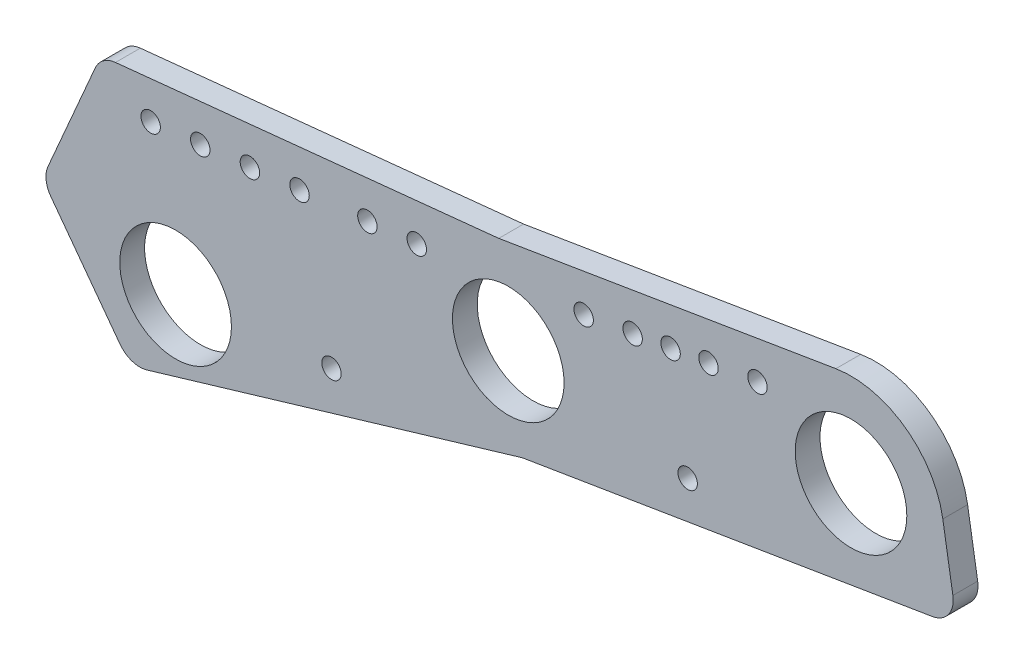
ISO-10303-21;
HEADER;
FILE_DESCRIPTION(('STEP AP214'),'2;1');
FILE_NAME('part.step','',(''),(''),'','','');
FILE_SCHEMA(('AUTOMOTIVE_DESIGN { 1 0 10303 214 1 1 1 1 }'));
ENDSEC;
DATA;
#1=APPLICATION_CONTEXT('core data for automotive mechanical design processes');
#2=APPLICATION_PROTOCOL_DEFINITION('international standard','automotive_design',2000,#1);
#3=PRODUCT_CONTEXT('',#1,'mechanical');
#4=PRODUCT('Part','Part','',(#3));
#5=PRODUCT_RELATED_PRODUCT_CATEGORY('part','',(#4));
#6=PRODUCT_DEFINITION_FORMATION('','',#4);
#7=PRODUCT_DEFINITION_CONTEXT('part definition',#1,'design');
#8=PRODUCT_DEFINITION('design','',#6,#7);
#9=PRODUCT_DEFINITION_SHAPE('','',#8);
#10=(LENGTH_UNIT() NAMED_UNIT(*) SI_UNIT(.MILLI.,.METRE.));
#11=(NAMED_UNIT(*) PLANE_ANGLE_UNIT() SI_UNIT($,.RADIAN.));
#12=(NAMED_UNIT(*) SI_UNIT($,.STERADIAN.) SOLID_ANGLE_UNIT());
#13=UNCERTAINTY_MEASURE_WITH_UNIT(LENGTH_MEASURE(1.E-05),#10,'distance_accuracy_value','');
#14=(GEOMETRIC_REPRESENTATION_CONTEXT(3) GLOBAL_UNCERTAINTY_ASSIGNED_CONTEXT((#13)) GLOBAL_UNIT_ASSIGNED_CONTEXT((#10,
#11,#12)) REPRESENTATION_CONTEXT('',''));
#15=CARTESIAN_POINT('',(0.,0.,0.));
#16=DIRECTION('',(0.,0.,1.));
#17=DIRECTION('',(1.,0.,0.));
#18=AXIS2_PLACEMENT_3D('',#15,#16,#17);
#19=CARTESIAN_POINT('',(731.086146989686,120.40181435366,6.35));
#20=DIRECTION('',(0.98670854359306,0.162500000001419,0.));
#21=DIRECTION('',(-0.162500000001419,0.986708543593061,0.));
#22=AXIS2_PLACEMENT_3D('',#19,#20,#21);
#23=PLANE('',#22);
#24=DIRECTION('',(0.162500000001419,-0.986708543593061,0.));
#25=VECTOR('',#24,1.);
#26=CARTESIAN_POINT('',(731.086146989686,120.40181435366,6.35));
#27=LINE('',#26,#25);
#28=CARTESIAN_POINT('',(693.805030313548,346.774714899592,6.35));
#29=VERTEX_POINT('',#28);
#30=CARTESIAN_POINT('',(696.384717564513,331.110718282341,6.35));
#31=VERTEX_POINT('',#30);
#32=EDGE_CURVE('E138',#29,#31,#27,.T.);
#33=ORIENTED_EDGE('',*,*,#32,.T.);
#34=DIRECTION('',(0.,0.,-1.));
#35=VECTOR('',#34,1.);
#36=CARTESIAN_POINT('',(696.384717564513,331.110718282341,0.));
#37=LINE('',#36,#35);
#38=CARTESIAN_POINT('',(696.384717564513,331.110718282341,0.));
#39=VERTEX_POINT('',#38);
#40=EDGE_CURVE('E281',#31,#39,#37,.T.);
#41=ORIENTED_EDGE('',*,*,#40,.T.);
#42=DIRECTION('',(0.162500000001419,-0.986708543593061,0.));
#43=VECTOR('',#42,1.);
#44=CARTESIAN_POINT('',(731.086146989686,120.40181435366,0.));
#45=LINE('',#44,#43);
#46=CARTESIAN_POINT('',(693.805030313548,346.774714899592,0.));
#47=VERTEX_POINT('',#46);
#48=EDGE_CURVE('E141',#47,#39,#45,.T.);
#49=ORIENTED_EDGE('',*,*,#48,.F.);
#50=DIRECTION('',(0.,0.,-1.));
#51=VECTOR('',#50,1.);
#52=CARTESIAN_POINT('',(693.805030313548,346.774714899592,6.35));
#53=LINE('',#52,#51);
#54=EDGE_CURVE('E134',#29,#47,#53,.T.);
#55=ORIENTED_EDGE('',*,*,#54,.F.);
#56=EDGE_LOOP('',(#33,#41,#49,#55));
#57=FACE_BOUND('',#56,.T.);
#58=ADVANCED_FACE('F39',(#57),#23,.T.);
#59=CARTESIAN_POINT('',(670.309034631527,342.905183898615,6.35));
#60=DIRECTION('',(0.,0.,-1.));
#61=DIRECTION('',(-1.,0.,0.));
#62=AXIS2_PLACEMENT_3D('',#59,#60,#61);
#63=CYLINDRICAL_SURFACE('',#62,23.8124984673398);
#64=CARTESIAN_POINT('',(670.309034631527,342.905183898615,0.));
#65=DIRECTION('',(0.,0.,1.));
#66=DIRECTION('',(1.,0.,0.));
#67=AXIS2_PLACEMENT_3D('',#64,#65,#66);
#68=CIRCLE('',#67,23.8124984673398);
#69=CARTESIAN_POINT('',(666.439503131669,366.401182605088,0.));
#70=VERTEX_POINT('',#69);
#71=EDGE_CURVE('E230',#47,#70,#68,.T.);
#72=ORIENTED_EDGE('',*,*,#71,.T.);
#73=DIRECTION('',(0.,0.,-1.));
#74=VECTOR('',#73,1.);
#75=CARTESIAN_POINT('',(666.439503131669,366.401182605088,6.35));
#76=LINE('',#75,#74);
#77=CARTESIAN_POINT('',(666.439503131669,366.401182605088,6.35));
#78=VERTEX_POINT('',#77);
#79=EDGE_CURVE('E146',#78,#70,#76,.T.);
#80=ORIENTED_EDGE('',*,*,#79,.F.);
#81=CARTESIAN_POINT('',(670.309034631527,342.905183898615,6.35));
#82=DIRECTION('',(0.,0.,1.));
#83=DIRECTION('',(1.,0.,0.));
#84=AXIS2_PLACEMENT_3D('',#81,#82,#83);
#85=CIRCLE('',#84,23.8124984673398);
#86=EDGE_CURVE('E149',#29,#78,#85,.T.);
#87=ORIENTED_EDGE('',*,*,#86,.F.);
#88=ORIENTED_EDGE('',*,*,#54,.T.);
#89=EDGE_LOOP('',(#72,#80,#87,#88));
#90=FACE_BOUND('',#89,.T.);
#91=ADVANCED_FACE('F150',(#90),#63,.T.);
#92=CARTESIAN_POINT('',(-41.2181103923822,249.488953926443,6.35));
#93=DIRECTION('',(-0.163000634952375,0.986625964084223,0.));
#94=DIRECTION('',(-0.986625964084223,-0.163000634952375,0.));
#95=AXIS2_PLACEMENT_3D('',#92,#93,#94);
#96=PLANE('',#95);
#97=DIRECTION('',(0.986625964084223,0.163000634952375,0.));
#98=VECTOR('',#97,1.);
#99=CARTESIAN_POINT('',(-41.2181103923822,249.488953926443,0.));
#100=LINE('',#99,#98);
#101=CARTESIAN_POINT('',(580.162002092372,352.147262717055,0.));
#102=VERTEX_POINT('',#101);
#103=EDGE_CURVE('E232',#102,#70,#100,.T.);
#104=ORIENTED_EDGE('',*,*,#103,.F.);
#105=DIRECTION('',(0.,0.,-1.));
#106=VECTOR('',#105,1.);
#107=CARTESIAN_POINT('',(580.162002092372,352.147262717055,6.35));
#108=LINE('',#107,#106);
#109=CARTESIAN_POINT('',(580.162002092372,352.147262717055,6.35));
#110=VERTEX_POINT('',#109);
#111=EDGE_CURVE('E183',#110,#102,#108,.T.);
#112=ORIENTED_EDGE('',*,*,#111,.F.);
#113=DIRECTION('',(0.986625964084223,0.163000634952375,0.));
#114=VECTOR('',#113,1.);
#115=CARTESIAN_POINT('',(-41.2181103923822,249.488953926443,6.35));
#116=LINE('',#115,#114);
#117=EDGE_CURVE('E153',#110,#78,#116,.T.);
#118=ORIENTED_EDGE('',*,*,#117,.T.);
#119=ORIENTED_EDGE('',*,*,#79,.T.);
#120=EDGE_LOOP('',(#104,#112,#118,#119));
#121=FACE_BOUND('',#120,.T.);
#122=ADVANCED_FACE('F311',(#121),#96,.T.);
#123=CARTESIAN_POINT('',(-29.6934496843003,289.621909583042,6.35));
#124=DIRECTION('',(-0.101990247303204,0.994785398694126,0.));
#125=DIRECTION('',(-0.994785398694126,-0.101990247303204,0.));
#126=AXIS2_PLACEMENT_3D('',#123,#124,#125);
#127=PLANE('',#126);
#128=DIRECTION('',(0.994785398694126,0.101990247303204,0.));
#129=VECTOR('',#128,1.);
#130=CARTESIAN_POINT('',(-29.6934496843003,289.621909583042,0.));
#131=LINE('',#130,#129);
#132=CARTESIAN_POINT('',(482.067967572445,342.090184222749,0.));
#133=VERTEX_POINT('',#132);
#134=EDGE_CURVE('E235',#133,#102,#131,.T.);
#135=ORIENTED_EDGE('',*,*,#134,.F.);
#136=DIRECTION('',(0.,0.,-1.));
#137=VECTOR('',#136,1.);
#138=CARTESIAN_POINT('',(482.067967572445,342.090184222749,6.35));
#139=LINE('',#138,#137);
#140=CARTESIAN_POINT('',(482.067967572445,342.090184222749,6.35));
#141=VERTEX_POINT('',#140);
#142=EDGE_CURVE('E267',#133,#141,#139,.F.);
#143=ORIENTED_EDGE('',*,*,#142,.T.);
#144=DIRECTION('',(0.994785398694126,0.101990247303204,0.));
#145=VECTOR('',#144,1.);
#146=CARTESIAN_POINT('',(-29.6934496843003,289.621909583042,6.35));
#147=LINE('',#146,#145);
#148=EDGE_CURVE('E168',#141,#110,#147,.T.);
#149=ORIENTED_EDGE('',*,*,#148,.T.);
#150=ORIENTED_EDGE('',*,*,#111,.T.);
#151=EDGE_LOOP('',(#135,#143,#149,#150));
#152=FACE_BOUND('',#151,.T.);
#153=ADVANCED_FACE('F595',(#152),#127,.T.);
#154=CARTESIAN_POINT('',(278.01733419596,-120.507999634207,6.35));
#155=DIRECTION('',(-0.917514899276574,0.397701407598085,0.));
#156=DIRECTION('',(-0.397701407598085,-0.917514899276574,0.));
#157=AXIS2_PLACEMENT_3D('',#154,#155,#156);
#158=PLANE('',#157);
#159=DIRECTION('',(0.397701407598085,0.917514899276574,0.));
#160=VECTOR('',#159,1.);
#161=CARTESIAN_POINT('',(278.01733419596,-120.507999634207,6.35));
#162=LINE('',#161,#160);
#163=CARTESIAN_POINT('',(464.795912272287,310.398517105886,6.35));
#164=VERTEX_POINT('',#163);
#165=CARTESIAN_POINT('',(476.889386032415,338.298700879289,6.35));
#166=VERTEX_POINT('',#165);
#167=EDGE_CURVE('E170',#164,#166,#162,.T.);
#168=ORIENTED_EDGE('',*,*,#167,.T.);
#169=DIRECTION('',(0.,0.,-1.));
#170=VECTOR('',#169,1.);
#171=CARTESIAN_POINT('',(476.889386032415,338.298700879289,6.35));
#172=LINE('',#171,#170);
#173=CARTESIAN_POINT('',(476.889386032415,338.298700879289,0.));
#174=VERTEX_POINT('',#173);
#175=EDGE_CURVE('E256',#166,#174,#172,.T.);
#176=ORIENTED_EDGE('',*,*,#175,.T.);
#177=DIRECTION('',(0.397701407598085,0.917514899276574,0.));
#178=VECTOR('',#177,1.);
#179=CARTESIAN_POINT('',(278.01733419596,-120.507999634207,0.));
#180=LINE('',#179,#178);
#181=CARTESIAN_POINT('',(464.795912272287,310.398517105886,0.));
#182=VERTEX_POINT('',#181);
#183=EDGE_CURVE('E237',#182,#174,#180,.T.);
#184=ORIENTED_EDGE('',*,*,#183,.F.);
#185=DIRECTION('',(0.,0.,-1.));
#186=VECTOR('',#185,1.);
#187=CARTESIAN_POINT('',(464.795912272287,310.398517105886,6.35));
#188=LINE('',#187,#186);
#189=EDGE_CURVE('E145',#182,#164,#188,.F.);
#190=ORIENTED_EDGE('',*,*,#189,.T.);
#191=EDGE_LOOP('',(#168,#176,#184,#190));
#192=FACE_BOUND('',#191,.T.);
#193=ADVANCED_FACE('F321',(#192),#158,.T.);
#194=CARTESIAN_POINT('',(445.807669818792,330.668951840406,6.35));
#195=DIRECTION('',(0.803176971739061,0.595740507325187,0.));
#196=DIRECTION('',(-0.595740507325187,0.803176971739061,0.));
#197=AXIS2_PLACEMENT_3D('',#194,#195,#196);
#198=PLANE('',#197);
#199=DIRECTION('',(0.595740507325187,-0.803176971739061,0.));
#200=VECTOR('',#199,1.);
#201=CARTESIAN_POINT('',(445.807669818792,330.668951840406,6.35));
#202=LINE('',#201,#200);
#203=CARTESIAN_POINT('',(465.52195811215,304.090160946123,6.35));
#204=VERTEX_POINT('',#203);
#205=CARTESIAN_POINT('',(483.204163538103,280.25102287668,6.35));
#206=VERTEX_POINT('',#205);
#207=EDGE_CURVE('E173',#204,#206,#202,.T.);
#208=ORIENTED_EDGE('',*,*,#207,.F.);
#209=DIRECTION('',(0.,0.,-1.));
#210=VECTOR('',#209,1.);
#211=CARTESIAN_POINT('',(465.52195811215,304.090160946123,0.));
#212=LINE('',#211,#210);
#213=CARTESIAN_POINT('',(465.52195811215,304.090160946123,0.));
#214=VERTEX_POINT('',#213);
#215=EDGE_CURVE('E278',#204,#214,#212,.T.);
#216=ORIENTED_EDGE('',*,*,#215,.T.);
#217=DIRECTION('',(0.595740507325187,-0.803176971739061,0.));
#218=VECTOR('',#217,1.);
#219=CARTESIAN_POINT('',(445.807669818792,330.668951840406,0.));
#220=LINE('',#219,#218);
#221=CARTESIAN_POINT('',(483.204163538103,280.25102287668,0.));
#222=VERTEX_POINT('',#221);
#223=EDGE_CURVE('E240',#214,#222,#220,.T.);
#224=ORIENTED_EDGE('',*,*,#223,.T.);
#225=DIRECTION('',(0.,0.,-1.));
#226=VECTOR('',#225,1.);
#227=CARTESIAN_POINT('',(483.204163538103,280.25102287668,6.35));
#228=LINE('',#227,#226);
#229=EDGE_CURVE('E276',#222,#206,#228,.F.);
#230=ORIENTED_EDGE('',*,*,#229,.T.);
#231=EDGE_LOOP('',(#208,#216,#224,#230));
#232=FACE_BOUND('',#231,.T.);
#233=ADVANCED_FACE('F330',(#232),#198,.F.);
#234=CARTESIAN_POINT('',(-36.1161970951066,121.416833655085,6.35));
#235=DIRECTION('',(-0.285110255646664,0.958494727228634,0.));
#236=DIRECTION('',(-0.958494727228634,-0.285110255646664,0.));
#237=AXIS2_PLACEMENT_3D('',#234,#235,#236);
#238=PLANE('',#237);
#239=DIRECTION('',(0.958494727228634,0.285110255646664,0.));
#240=VECTOR('',#239,1.);
#241=CARTESIAN_POINT('',(-36.1161970951066,121.416833655085,0.));
#242=LINE('',#241,#240);
#243=CARTESIAN_POINT('',(490.114787432002,277.947533580293,0.));
#244=VERTEX_POINT('',#243);
#245=CARTESIAN_POINT('',(585.818566139132,306.415221548109,0.));
#246=VERTEX_POINT('',#245);
#247=EDGE_CURVE('E243',#244,#246,#242,.T.);
#248=ORIENTED_EDGE('',*,*,#247,.T.);
#249=DIRECTION('',(0.,0.,-1.));
#250=VECTOR('',#249,1.);
#251=CARTESIAN_POINT('',(585.818566139132,306.415221548109,6.35));
#252=LINE('',#251,#250);
#253=CARTESIAN_POINT('',(585.818566139132,306.415221548109,6.35));
#254=VERTEX_POINT('',#253);
#255=EDGE_CURVE('E290',#246,#254,#252,.F.);
#256=ORIENTED_EDGE('',*,*,#255,.T.);
#257=DIRECTION('',(0.958494727228634,0.285110255646664,0.));
#258=VECTOR('',#257,1.);
#259=CARTESIAN_POINT('',(-36.1161970951066,121.416833655085,6.35));
#260=LINE('',#259,#258);
#261=CARTESIAN_POINT('',(490.114787432002,277.947533580293,6.35));
#262=VERTEX_POINT('',#261);
#263=EDGE_CURVE('E176',#262,#254,#260,.T.);
#264=ORIENTED_EDGE('',*,*,#263,.F.);
#265=DIRECTION('',(0.,0.,-1.));
#266=VECTOR('',#265,1.);
#267=CARTESIAN_POINT('',(490.114787432002,277.947533580293,6.35));
#268=LINE('',#267,#266);
#269=EDGE_CURVE('E287',#262,#244,#268,.T.);
#270=ORIENTED_EDGE('',*,*,#269,.T.);
#271=EDGE_LOOP('',(#248,#256,#264,#270));
#272=FACE_BOUND('',#271,.T.);
#273=ADVANCED_FACE('F300',(#272),#238,.F.);
#274=CARTESIAN_POINT('',(-33.6695544251646,204.443304676859,6.35));
#275=DIRECTION('',(-0.162500000001427,0.986708543593059,0.));
#276=DIRECTION('',(-0.986708543593059,-0.162500000001427,0.));
#277=AXIS2_PLACEMENT_3D('',#274,#275,#276);
#278=PLANE('',#277);
#279=DIRECTION('',(0.986708543593059,0.162500000001427,0.));
#280=VECTOR('',#279,1.);
#281=CARTESIAN_POINT('',(-33.6695544251646,204.443304676859,0.));
#282=LINE('',#281,#280);
#283=CARTESIAN_POINT('',(586.597141262479,306.594379282023,0.));
#284=VERTEX_POINT('',#283);
#285=CARTESIAN_POINT('',(691.150993312707,323.813244030516,0.));
#286=VERTEX_POINT('',#285);
#287=EDGE_CURVE('E246',#284,#286,#282,.T.);
#288=ORIENTED_EDGE('',*,*,#287,.T.);
#289=DIRECTION('',(0.,0.,-1.));
#290=VECTOR('',#289,1.);
#291=CARTESIAN_POINT('',(691.150993312707,323.813244030516,6.35));
#292=LINE('',#291,#290);
#293=CARTESIAN_POINT('',(691.150993312707,323.813244030516,6.35));
#294=VERTEX_POINT('',#293);
#295=EDGE_CURVE('E54',#286,#294,#292,.F.);
#296=ORIENTED_EDGE('',*,*,#295,.T.);
#297=DIRECTION('',(0.986708543593059,0.162500000001427,0.));
#298=VECTOR('',#297,1.);
#299=CARTESIAN_POINT('',(-33.6695544251646,204.443304676859,6.35));
#300=LINE('',#299,#298);
#301=CARTESIAN_POINT('',(586.597141262479,306.594379282023,6.35));
#302=VERTEX_POINT('',#301);
#303=EDGE_CURVE('E178',#302,#294,#300,.T.);
#304=ORIENTED_EDGE('',*,*,#303,.F.);
#305=DIRECTION('',(0.,0.,-1.));
#306=VECTOR('',#305,1.);
#307=CARTESIAN_POINT('',(586.597141262479,306.594379282023,0.));
#308=LINE('',#307,#306);
#309=EDGE_CURVE('E283',#302,#284,#308,.T.);
#310=ORIENTED_EDGE('',*,*,#309,.T.);
#311=EDGE_LOOP('',(#288,#296,#304,#310));
#312=FACE_BOUND('',#311,.T.);
#313=ADVANCED_FACE('F304',(#312),#278,.F.);
#314=CARTESIAN_POINT('',(497.451942830879,298.348687280984,6.35));
#315=DIRECTION('',(0.,0.,-1.));
#316=DIRECTION('',(-1.,0.,0.));
#317=AXIS2_PLACEMENT_3D('',#314,#315,#316);
#318=CYLINDRICAL_SURFACE('',#317,14.2875);
#319=CARTESIAN_POINT('',(497.451942830879,298.348687280984,6.35));
#320=DIRECTION('',(0.,0.,1.));
#321=DIRECTION('',(1.,0.,0.));
#322=AXIS2_PLACEMENT_3D('',#319,#320,#321);
#323=CIRCLE('',#322,14.2875);
#324=CARTESIAN_POINT('',(511.739442830879,298.348687280984,6.35));
#325=VERTEX_POINT('',#324);
#326=EDGE_CURVE('E160',#325,#325,#323,.T.);
#327=ORIENTED_EDGE('',*,*,#326,.T.);
#328=EDGE_LOOP('',(#327));
#329=FACE_BOUND('',#328,.T.);
#330=CARTESIAN_POINT('',(497.451942830879,298.348687280984,0.));
#331=DIRECTION('',(0.,0.,1.));
#332=DIRECTION('',(1.,0.,0.));
#333=AXIS2_PLACEMENT_3D('',#330,#331,#332);
#334=CIRCLE('',#333,14.2875);
#335=CARTESIAN_POINT('',(511.739442830879,298.348687280984,0.));
#336=VERTEX_POINT('',#335);
#337=EDGE_CURVE('E226',#336,#336,#334,.T.);
#338=ORIENTED_EDGE('',*,*,#337,.F.);
#339=EDGE_LOOP('',(#338));
#340=FACE_BOUND('',#339,.T.);
#341=ADVANCED_FACE('F346',(#329,#340),#318,.F.);
#342=CARTESIAN_POINT('',(670.309034381703,342.905185410778,6.35));
#343=DIRECTION('',(0.,0.,-1.));
#344=DIRECTION('',(-1.,0.,0.));
#345=AXIS2_PLACEMENT_3D('',#342,#343,#344);
#346=CYLINDRICAL_SURFACE('',#345,14.2875);
#347=CARTESIAN_POINT('',(670.309034381703,342.905185410778,6.35));
#348=DIRECTION('',(0.,0.,1.));
#349=DIRECTION('',(1.,0.,0.));
#350=AXIS2_PLACEMENT_3D('',#347,#348,#349);
#351=CIRCLE('',#350,14.2875);
#352=CARTESIAN_POINT('',(684.596534381703,342.905185410778,6.35));
#353=VERTEX_POINT('',#352);
#354=EDGE_CURVE('E163',#353,#353,#351,.T.);
#355=ORIENTED_EDGE('',*,*,#354,.T.);
#356=EDGE_LOOP('',(#355));
#357=FACE_BOUND('',#356,.T.);
#358=CARTESIAN_POINT('',(670.309034381703,342.905185410778,0.));
#359=DIRECTION('',(0.,0.,1.));
#360=DIRECTION('',(1.,0.,0.));
#361=AXIS2_PLACEMENT_3D('',#358,#359,#360);
#362=CIRCLE('',#361,14.2875);
#363=CARTESIAN_POINT('',(684.596534381703,342.905185410778,0.));
#364=VERTEX_POINT('',#363);
#365=EDGE_CURVE('E223',#364,#364,#362,.T.);
#366=ORIENTED_EDGE('',*,*,#365,.F.);
#367=EDGE_LOOP('',(#366));
#368=FACE_BOUND('',#367,.T.);
#369=ADVANCED_FACE('F349',(#357,#368),#346,.F.);
#370=CARTESIAN_POINT('',(582.59064485628,328.458935410651,6.35));
#371=DIRECTION('',(0.,0.,-1.));
#372=DIRECTION('',(-1.,0.,0.));
#373=AXIS2_PLACEMENT_3D('',#370,#371,#372);
#374=CYLINDRICAL_SURFACE('',#373,14.2875);
#375=CARTESIAN_POINT('',(582.59064485628,328.458935410651,6.35));
#376=DIRECTION('',(0.,0.,1.));
#377=DIRECTION('',(1.,0.,0.));
#378=AXIS2_PLACEMENT_3D('',#375,#376,#377);
#379=CIRCLE('',#378,14.2875);
#380=CARTESIAN_POINT('',(596.87814485628,328.458935410651,6.35));
#381=VERTEX_POINT('',#380);
#382=EDGE_CURVE('E757',#381,#381,#379,.T.);
#383=ORIENTED_EDGE('',*,*,#382,.T.);
#384=EDGE_LOOP('',(#383));
#385=FACE_BOUND('',#384,.T.);
#386=CARTESIAN_POINT('',(582.59064485628,328.458935410651,0.));
#387=DIRECTION('',(0.,0.,1.));
#388=DIRECTION('',(1.,0.,0.));
#389=AXIS2_PLACEMENT_3D('',#386,#387,#388);
#390=CIRCLE('',#389,14.2875);
#391=CARTESIAN_POINT('',(596.87814485628,328.458935410651,0.));
#392=VERTEX_POINT('',#391);
#393=EDGE_CURVE('E220',#392,#392,#390,.T.);
#394=ORIENTED_EDGE('',*,*,#393,.F.);
#395=EDGE_LOOP('',(#394));
#396=FACE_BOUND('',#395,.T.);
#397=ADVANCED_FACE('F353',(#385,#396),#374,.F.);
#398=CARTESIAN_POINT('',(537.342584874887,301.933194376825,6.35));
#399=DIRECTION('',(0.,0.,-1.));
#400=DIRECTION('',(-1.,0.,0.));
#401=AXIS2_PLACEMENT_3D('',#398,#399,#400);
#402=CYLINDRICAL_SURFACE('',#401,2.48920000000006);
#403=CARTESIAN_POINT('',(537.342584874887,301.933194376825,6.35));
#404=DIRECTION('',(0.,0.,1.));
#405=DIRECTION('',(1.,0.,0.));
#406=AXIS2_PLACEMENT_3D('',#403,#404,#405);
#407=CIRCLE('',#406,2.48920000000006);
#408=CARTESIAN_POINT('',(539.831784874887,301.933194376825,6.35));
#409=VERTEX_POINT('',#408);
#410=EDGE_CURVE('E753',#409,#409,#407,.T.);
#411=ORIENTED_EDGE('',*,*,#410,.T.);
#412=EDGE_LOOP('',(#411));
#413=FACE_BOUND('',#412,.T.);
#414=CARTESIAN_POINT('',(537.342584874887,301.933194376825,0.));
#415=DIRECTION('',(0.,0.,1.));
#416=DIRECTION('',(1.,0.,0.));
#417=AXIS2_PLACEMENT_3D('',#414,#415,#416);
#418=CIRCLE('',#417,2.48920000000006);
#419=CARTESIAN_POINT('',(539.831784874887,301.933194376825,0.));
#420=VERTEX_POINT('',#419);
#421=EDGE_CURVE('E217',#420,#420,#418,.T.);
#422=ORIENTED_EDGE('',*,*,#421,.F.);
#423=EDGE_LOOP('',(#422));
#424=FACE_BOUND('',#423,.T.);
#425=ADVANCED_FACE('F357',(#413,#424),#402,.F.);
#426=CARTESIAN_POINT('',(624.131786081978,349.757403361221,6.35));
#427=DIRECTION('',(0.,0.,-1.));
#428=DIRECTION('',(-1.,0.,0.));
#429=AXIS2_PLACEMENT_3D('',#426,#427,#428);
#430=CYLINDRICAL_SURFACE('',#429,2.48919999999983);
#431=CARTESIAN_POINT('',(624.131786081978,349.757403361221,6.35));
#432=DIRECTION('',(0.,0.,1.));
#433=DIRECTION('',(1.,0.,0.));
#434=AXIS2_PLACEMENT_3D('',#431,#432,#433);
#435=CIRCLE('',#434,2.48919999999983);
#436=CARTESIAN_POINT('',(626.620986081978,349.757403361221,6.35));
#437=VERTEX_POINT('',#436);
#438=EDGE_CURVE('E749',#437,#437,#435,.T.);
#439=ORIENTED_EDGE('',*,*,#438,.T.);
#440=EDGE_LOOP('',(#439));
#441=FACE_BOUND('',#440,.T.);
#442=CARTESIAN_POINT('',(624.131786081978,349.757403361221,0.));
#443=DIRECTION('',(0.,0.,1.));
#444=DIRECTION('',(1.,0.,0.));
#445=AXIS2_PLACEMENT_3D('',#442,#443,#444);
#446=CIRCLE('',#445,2.48919999999983);
#447=CARTESIAN_POINT('',(626.620986081978,349.757403361221,0.));
#448=VERTEX_POINT('',#447);
#449=EDGE_CURVE('E214',#448,#448,#446,.T.);
#450=ORIENTED_EDGE('',*,*,#449,.F.);
#451=EDGE_LOOP('',(#450));
#452=FACE_BOUND('',#451,.T.);
#453=ADVANCED_FACE('F361',(#441,#452),#430,.F.);
#454=CARTESIAN_POINT('',(628.513589619009,323.150861907083,6.35));
#455=DIRECTION('',(0.,0.,-1.));
#456=DIRECTION('',(-1.,0.,0.));
#457=AXIS2_PLACEMENT_3D('',#454,#455,#456);
#458=CYLINDRICAL_SURFACE('',#457,2.48919999999983);
#459=CARTESIAN_POINT('',(628.513589619009,323.150861907083,6.35));
#460=DIRECTION('',(0.,0.,1.));
#461=DIRECTION('',(1.,0.,0.));
#462=AXIS2_PLACEMENT_3D('',#459,#460,#461);
#463=CIRCLE('',#462,2.48919999999983);
#464=CARTESIAN_POINT('',(631.002789619009,323.150861907083,6.35));
#465=VERTEX_POINT('',#464);
#466=EDGE_CURVE('E745',#465,#465,#463,.T.);
#467=ORIENTED_EDGE('',*,*,#466,.T.);
#468=EDGE_LOOP('',(#467));
#469=FACE_BOUND('',#468,.T.);
#470=CARTESIAN_POINT('',(628.513589619009,323.150861907083,0.));
#471=DIRECTION('',(0.,0.,1.));
#472=DIRECTION('',(1.,0.,0.));
#473=AXIS2_PLACEMENT_3D('',#470,#471,#472);
#474=CIRCLE('',#473,2.48919999999983);
#475=CARTESIAN_POINT('',(631.002789619009,323.150861907083,0.));
#476=VERTEX_POINT('',#475);
#477=EDGE_CURVE('E211',#476,#476,#474,.T.);
#478=ORIENTED_EDGE('',*,*,#477,.F.);
#479=EDGE_LOOP('',(#478));
#480=FACE_BOUND('',#479,.T.);
#481=ADVANCED_FACE('F365',(#469,#480),#458,.F.);
#482=CARTESIAN_POINT('',(491.068415606358,333.438024580599,6.35));
#483=DIRECTION('',(0.,0.,-1.));
#484=DIRECTION('',(-1.,0.,0.));
#485=AXIS2_PLACEMENT_3D('',#482,#483,#484);
#486=CYLINDRICAL_SURFACE('',#485,2.48919999999995);
#487=CARTESIAN_POINT('',(491.068415606358,333.438024580599,6.35));
#488=DIRECTION('',(0.,0.,1.));
#489=DIRECTION('',(1.,0.,0.));
#490=AXIS2_PLACEMENT_3D('',#487,#488,#489);
#491=CIRCLE('',#490,2.48919999999995);
#492=CARTESIAN_POINT('',(493.557615606358,333.438024580599,6.35));
#493=VERTEX_POINT('',#492);
#494=EDGE_CURVE('E741',#493,#493,#491,.T.);
#495=ORIENTED_EDGE('',*,*,#494,.T.);
#496=EDGE_LOOP('',(#495));
#497=FACE_BOUND('',#496,.T.);
#498=CARTESIAN_POINT('',(491.068415606358,333.438024580599,0.));
#499=DIRECTION('',(0.,0.,1.));
#500=DIRECTION('',(1.,0.,0.));
#501=AXIS2_PLACEMENT_3D('',#498,#499,#500);
#502=CIRCLE('',#501,2.48919999999995);
#503=CARTESIAN_POINT('',(493.557615606358,333.438024580599,0.));
#504=VERTEX_POINT('',#503);
#505=EDGE_CURVE('E208',#504,#504,#502,.T.);
#506=ORIENTED_EDGE('',*,*,#505,.F.);
#507=EDGE_LOOP('',(#506));
#508=FACE_BOUND('',#507,.T.);
#509=ADVANCED_FACE('F369',(#497,#508),#486,.F.);
#510=CARTESIAN_POINT('',(503.768415606358,334.740090475867,6.35));
#511=DIRECTION('',(0.,0.,-1.));
#512=DIRECTION('',(-1.,0.,0.));
#513=AXIS2_PLACEMENT_3D('',#510,#511,#512);
#514=CYLINDRICAL_SURFACE('',#513,2.48919999999995);
#515=CARTESIAN_POINT('',(503.768415606358,334.740090475867,6.35));
#516=DIRECTION('',(0.,0.,1.));
#517=DIRECTION('',(1.,0.,0.));
#518=AXIS2_PLACEMENT_3D('',#515,#516,#517);
#519=CIRCLE('',#518,2.48919999999995);
#520=CARTESIAN_POINT('',(506.257615606357,334.740090475867,6.35));
#521=VERTEX_POINT('',#520);
#522=EDGE_CURVE('E737',#521,#521,#519,.T.);
#523=ORIENTED_EDGE('',*,*,#522,.T.);
#524=EDGE_LOOP('',(#523));
#525=FACE_BOUND('',#524,.T.);
#526=CARTESIAN_POINT('',(503.768415606358,334.740090475867,0.));
#527=DIRECTION('',(0.,0.,1.));
#528=DIRECTION('',(1.,0.,0.));
#529=AXIS2_PLACEMENT_3D('',#526,#527,#528);
#530=CIRCLE('',#529,2.48919999999995);
#531=CARTESIAN_POINT('',(506.257615606357,334.740090475867,0.));
#532=VERTEX_POINT('',#531);
#533=EDGE_CURVE('E205',#532,#532,#530,.T.);
#534=ORIENTED_EDGE('',*,*,#533,.F.);
#535=EDGE_LOOP('',(#534));
#536=FACE_BOUND('',#535,.T.);
#537=ADVANCED_FACE('F373',(#525,#536),#514,.F.);
#538=CARTESIAN_POINT('',(516.468415606357,336.042156371136,6.35));
#539=DIRECTION('',(0.,0.,-1.));
#540=DIRECTION('',(-1.,0.,0.));
#541=AXIS2_PLACEMENT_3D('',#538,#539,#540);
#542=CYLINDRICAL_SURFACE('',#541,2.48919999999995);
#543=CARTESIAN_POINT('',(516.468415606357,336.042156371136,6.35));
#544=DIRECTION('',(0.,0.,1.));
#545=DIRECTION('',(1.,0.,0.));
#546=AXIS2_PLACEMENT_3D('',#543,#544,#545);
#547=CIRCLE('',#546,2.48919999999995);
#548=CARTESIAN_POINT('',(518.957615606357,336.042156371136,6.35));
#549=VERTEX_POINT('',#548);
#550=EDGE_CURVE('E733',#549,#549,#547,.T.);
#551=ORIENTED_EDGE('',*,*,#550,.T.);
#552=EDGE_LOOP('',(#551));
#553=FACE_BOUND('',#552,.T.);
#554=CARTESIAN_POINT('',(516.468415606357,336.042156371136,0.));
#555=DIRECTION('',(0.,0.,1.));
#556=DIRECTION('',(1.,0.,0.));
#557=AXIS2_PLACEMENT_3D('',#554,#555,#556);
#558=CIRCLE('',#557,2.48919999999995);
#559=CARTESIAN_POINT('',(518.957615606357,336.042156371136,0.));
#560=VERTEX_POINT('',#559);
#561=EDGE_CURVE('E202',#560,#560,#558,.T.);
#562=ORIENTED_EDGE('',*,*,#561,.F.);
#563=EDGE_LOOP('',(#562));
#564=FACE_BOUND('',#563,.T.);
#565=ADVANCED_FACE('F377',(#553,#564),#542,.F.);
#566=CARTESIAN_POINT('',(529.168415606357,337.344222266404,6.35));
#567=DIRECTION('',(0.,0.,-1.));
#568=DIRECTION('',(-1.,0.,0.));
#569=AXIS2_PLACEMENT_3D('',#566,#567,#568);
#570=CYLINDRICAL_SURFACE('',#569,2.48919999999995);
#571=CARTESIAN_POINT('',(529.168415606357,337.344222266404,6.35));
#572=DIRECTION('',(0.,0.,1.));
#573=DIRECTION('',(1.,0.,0.));
#574=AXIS2_PLACEMENT_3D('',#571,#572,#573);
#575=CIRCLE('',#574,2.48919999999995);
#576=CARTESIAN_POINT('',(531.657615606357,337.344222266404,6.35));
#577=VERTEX_POINT('',#576);
#578=EDGE_CURVE('E729',#577,#577,#575,.T.);
#579=ORIENTED_EDGE('',*,*,#578,.T.);
#580=EDGE_LOOP('',(#579));
#581=FACE_BOUND('',#580,.T.);
#582=CARTESIAN_POINT('',(529.168415606357,337.344222266404,0.));
#583=DIRECTION('',(0.,0.,1.));
#584=DIRECTION('',(1.,0.,0.));
#585=AXIS2_PLACEMENT_3D('',#582,#583,#584);
#586=CIRCLE('',#585,2.48919999999995);
#587=CARTESIAN_POINT('',(531.657615606357,337.344222266404,0.));
#588=VERTEX_POINT('',#587);
#589=EDGE_CURVE('E199',#588,#588,#586,.T.);
#590=ORIENTED_EDGE('',*,*,#589,.F.);
#591=EDGE_LOOP('',(#590));
#592=FACE_BOUND('',#591,.T.);
#593=ADVANCED_FACE('F381',(#581,#592),#570,.F.);
#594=CARTESIAN_POINT('',(633.842653383531,351.361737317261,6.35));
#595=DIRECTION('',(0.,0.,-1.));
#596=DIRECTION('',(-1.,0.,0.));
#597=AXIS2_PLACEMENT_3D('',#594,#595,#596);
#598=CYLINDRICAL_SURFACE('',#597,2.48919999999997);
#599=CARTESIAN_POINT('',(633.842653383531,351.361737317261,6.35));
#600=DIRECTION('',(0.,0.,1.));
#601=DIRECTION('',(1.,0.,0.));
#602=AXIS2_PLACEMENT_3D('',#599,#600,#601);
#603=CIRCLE('',#602,2.48919999999997);
#604=CARTESIAN_POINT('',(636.331853383531,351.361737317261,6.35));
#605=VERTEX_POINT('',#604);
#606=EDGE_CURVE('E725',#605,#605,#603,.T.);
#607=ORIENTED_EDGE('',*,*,#606,.T.);
#608=EDGE_LOOP('',(#607));
#609=FACE_BOUND('',#608,.T.);
#610=CARTESIAN_POINT('',(633.842653383531,351.361737317261,0.));
#611=DIRECTION('',(0.,0.,1.));
#612=DIRECTION('',(1.,0.,0.));
#613=AXIS2_PLACEMENT_3D('',#610,#611,#612);
#614=CIRCLE('',#613,2.48919999999997);
#615=CARTESIAN_POINT('',(636.331853383531,351.361737317261,0.));
#616=VERTEX_POINT('',#615);
#617=EDGE_CURVE('E196',#616,#616,#614,.T.);
#618=ORIENTED_EDGE('',*,*,#617,.F.);
#619=EDGE_LOOP('',(#618));
#620=FACE_BOUND('',#619,.T.);
#621=ADVANCED_FACE('F385',(#609,#620),#598,.F.);
#622=CARTESIAN_POINT('',(646.372803127401,353.431845381156,6.35));
#623=DIRECTION('',(0.,0.,-1.));
#624=DIRECTION('',(-1.,0.,0.));
#625=AXIS2_PLACEMENT_3D('',#622,#623,#624);
#626=CYLINDRICAL_SURFACE('',#625,2.48919999999981);
#627=CARTESIAN_POINT('',(646.372803127401,353.431845381156,6.35));
#628=DIRECTION('',(0.,0.,1.));
#629=DIRECTION('',(1.,0.,0.));
#630=AXIS2_PLACEMENT_3D('',#627,#628,#629);
#631=CIRCLE('',#630,2.48919999999981);
#632=CARTESIAN_POINT('',(648.8620031274,353.431845381156,6.35));
#633=VERTEX_POINT('',#632);
#634=EDGE_CURVE('E721',#633,#633,#631,.T.);
#635=ORIENTED_EDGE('',*,*,#634,.T.);
#636=EDGE_LOOP('',(#635));
#637=FACE_BOUND('',#636,.T.);
#638=CARTESIAN_POINT('',(646.372803127401,353.431845381156,0.));
#639=DIRECTION('',(0.,0.,1.));
#640=DIRECTION('',(1.,0.,0.));
#641=AXIS2_PLACEMENT_3D('',#638,#639,#640);
#642=CIRCLE('',#641,2.48919999999981);
#643=CARTESIAN_POINT('',(648.8620031274,353.431845381156,0.));
#644=VERTEX_POINT('',#643);
#645=EDGE_CURVE('E193',#644,#644,#642,.T.);
#646=ORIENTED_EDGE('',*,*,#645,.F.);
#647=EDGE_LOOP('',(#646));
#648=FACE_BOUND('',#647,.T.);
#649=ADVANCED_FACE('F389',(#637,#648),#626,.F.);
#650=CARTESIAN_POINT('',(546.539855631054,339.125226959936,6.35));
#651=DIRECTION('',(0.,0.,-1.));
#652=DIRECTION('',(-1.,0.,0.));
#653=AXIS2_PLACEMENT_3D('',#650,#651,#652);
#654=CYLINDRICAL_SURFACE('',#653,2.48919999999995);
#655=CARTESIAN_POINT('',(546.539855631054,339.125226959936,6.35));
#656=DIRECTION('',(0.,0.,1.));
#657=DIRECTION('',(1.,0.,0.));
#658=AXIS2_PLACEMENT_3D('',#655,#656,#657);
#659=CIRCLE('',#658,2.48919999999995);
#660=CARTESIAN_POINT('',(549.029055631054,339.125226959936,6.35));
#661=VERTEX_POINT('',#660);
#662=EDGE_CURVE('E717',#661,#661,#659,.T.);
#663=ORIENTED_EDGE('',*,*,#662,.T.);
#664=EDGE_LOOP('',(#663));
#665=FACE_BOUND('',#664,.T.);
#666=CARTESIAN_POINT('',(546.539855631054,339.125226959936,0.));
#667=DIRECTION('',(0.,0.,1.));
#668=DIRECTION('',(1.,0.,0.));
#669=AXIS2_PLACEMENT_3D('',#666,#667,#668);
#670=CIRCLE('',#669,2.48919999999995);
#671=CARTESIAN_POINT('',(549.029055631054,339.125226959936,0.));
#672=VERTEX_POINT('',#671);
#673=EDGE_CURVE('E190',#672,#672,#670,.T.);
#674=ORIENTED_EDGE('',*,*,#673,.F.);
#675=EDGE_LOOP('',(#674));
#676=FACE_BOUND('',#675,.T.);
#677=ADVANCED_FACE('F393',(#665,#676),#654,.F.);
#678=CARTESIAN_POINT('',(559.173630194469,340.420503100687,6.35));
#679=DIRECTION('',(0.,0.,-1.));
#680=DIRECTION('',(-1.,0.,0.));
#681=AXIS2_PLACEMENT_3D('',#678,#679,#680);
#682=CYLINDRICAL_SURFACE('',#681,2.48919999999995);
#683=CARTESIAN_POINT('',(559.173630194469,340.420503100687,6.35));
#684=DIRECTION('',(0.,0.,1.));
#685=DIRECTION('',(1.,0.,0.));
#686=AXIS2_PLACEMENT_3D('',#683,#684,#685);
#687=CIRCLE('',#686,2.48919999999995);
#688=CARTESIAN_POINT('',(561.662830194469,340.420503100687,6.35));
#689=VERTEX_POINT('',#688);
#690=EDGE_CURVE('E713',#689,#689,#687,.T.);
#691=ORIENTED_EDGE('',*,*,#690,.T.);
#692=EDGE_LOOP('',(#691));
#693=FACE_BOUND('',#692,.T.);
#694=CARTESIAN_POINT('',(559.173630194469,340.420503100687,0.));
#695=DIRECTION('',(0.,0.,1.));
#696=DIRECTION('',(1.,0.,0.));
#697=AXIS2_PLACEMENT_3D('',#694,#695,#696);
#698=CIRCLE('',#697,2.48919999999995);
#699=CARTESIAN_POINT('',(561.662830194469,340.420503100687,0.));
#700=VERTEX_POINT('',#699);
#701=EDGE_CURVE('E187',#700,#700,#698,.T.);
#702=ORIENTED_EDGE('',*,*,#701,.F.);
#703=EDGE_LOOP('',(#702));
#704=FACE_BOUND('',#703,.T.);
#705=ADVANCED_FACE('F397',(#693,#704),#682,.F.);
#706=CARTESIAN_POINT('',(601.887051665724,346.105533412414,6.35));
#707=DIRECTION('',(0.,0.,-1.));
#708=DIRECTION('',(-1.,0.,0.));
#709=AXIS2_PLACEMENT_3D('',#706,#707,#708);
#710=CYLINDRICAL_SURFACE('',#709,2.48919999999985);
#711=CARTESIAN_POINT('',(601.887051665724,346.105533412414,6.35));
#712=DIRECTION('',(0.,0.,1.));
#713=DIRECTION('',(1.,0.,0.));
#714=AXIS2_PLACEMENT_3D('',#711,#712,#713);
#715=CIRCLE('',#714,2.48919999999985);
#716=CARTESIAN_POINT('',(604.376251665724,346.105533412414,6.35));
#717=VERTEX_POINT('',#716);
#718=EDGE_CURVE('E251',#717,#717,#715,.F.);
#719=ORIENTED_EDGE('',*,*,#718,.F.);
#720=EDGE_LOOP('',(#719));
#721=FACE_BOUND('',#720,.T.);
#722=CARTESIAN_POINT('',(601.887051665724,346.105533412414,0.));
#723=DIRECTION('',(0.,0.,1.));
#724=DIRECTION('',(1.,0.,0.));
#725=AXIS2_PLACEMENT_3D('',#722,#723,#724);
#726=CIRCLE('',#725,2.48919999999985);
#727=CARTESIAN_POINT('',(604.376251665724,346.105533412414,0.));
#728=VERTEX_POINT('',#727);
#729=EDGE_CURVE('E184',#728,#728,#726,.F.);
#730=ORIENTED_EDGE('',*,*,#729,.T.);
#731=EDGE_LOOP('',(#730));
#732=FACE_BOUND('',#731,.T.);
#733=ADVANCED_FACE('F401',(#721,#732),#710,.F.);
#734=CARTESIAN_POINT('',(614.419295702902,348.162924817233,6.35));
#735=DIRECTION('',(0.,0.,-1.));
#736=DIRECTION('',(-1.,0.,0.));
#737=AXIS2_PLACEMENT_3D('',#734,#735,#736);
#738=CYLINDRICAL_SURFACE('',#737,2.48919999999996);
#739=CARTESIAN_POINT('',(614.419295702902,348.162924817233,6.35));
#740=DIRECTION('',(0.,0.,1.));
#741=DIRECTION('',(1.,0.,0.));
#742=AXIS2_PLACEMENT_3D('',#739,#740,#741);
#743=CIRCLE('',#742,2.48919999999996);
#744=CARTESIAN_POINT('',(616.908495702902,348.162924817233,6.35));
#745=VERTEX_POINT('',#744);
#746=EDGE_CURVE('E180',#745,#745,#743,.F.);
#747=ORIENTED_EDGE('',*,*,#746,.F.);
#748=EDGE_LOOP('',(#747));
#749=FACE_BOUND('',#748,.T.);
#750=CARTESIAN_POINT('',(614.419295702902,348.162924817233,0.));
#751=DIRECTION('',(0.,0.,1.));
#752=DIRECTION('',(1.,0.,0.));
#753=AXIS2_PLACEMENT_3D('',#750,#751,#752);
#754=CIRCLE('',#753,2.48919999999996);
#755=CARTESIAN_POINT('',(616.908495702902,348.162924817233,0.));
#756=VERTEX_POINT('',#755);
#757=EDGE_CURVE('E248',#756,#756,#754,.F.);
#758=ORIENTED_EDGE('',*,*,#757,.T.);
#759=EDGE_LOOP('',(#758));
#760=FACE_BOUND('',#759,.T.);
#761=ADVANCED_FACE('F405',(#749,#760),#738,.F.);
#762=CARTESIAN_POINT('',(0.,0.,6.35));
#763=DIRECTION('',(0.,0.,1.));
#764=DIRECTION('',(1.,0.,0.));
#765=AXIS2_PLACEMENT_3D('',#762,#763,#764);
#766=PLANE('',#765);
#767=ORIENTED_EDGE('',*,*,#718,.T.);
#768=EDGE_LOOP('',(#767));
#769=FACE_BOUND('',#768,.T.);
#770=ORIENTED_EDGE('',*,*,#690,.F.);
#771=EDGE_LOOP('',(#770));
#772=FACE_BOUND('',#771,.T.);
#773=ORIENTED_EDGE('',*,*,#662,.F.);
#774=EDGE_LOOP('',(#773));
#775=FACE_BOUND('',#774,.T.);
#776=ORIENTED_EDGE('',*,*,#634,.F.);
#777=EDGE_LOOP('',(#776));
#778=FACE_BOUND('',#777,.T.);
#779=ORIENTED_EDGE('',*,*,#606,.F.);
#780=EDGE_LOOP('',(#779));
#781=FACE_BOUND('',#780,.T.);
#782=ORIENTED_EDGE('',*,*,#578,.F.);
#783=EDGE_LOOP('',(#782));
#784=FACE_BOUND('',#783,.T.);
#785=ORIENTED_EDGE('',*,*,#550,.F.);
#786=EDGE_LOOP('',(#785));
#787=FACE_BOUND('',#786,.T.);
#788=ORIENTED_EDGE('',*,*,#522,.F.);
#789=EDGE_LOOP('',(#788));
#790=FACE_BOUND('',#789,.T.);
#791=ORIENTED_EDGE('',*,*,#494,.F.);
#792=EDGE_LOOP('',(#791));
#793=FACE_BOUND('',#792,.T.);
#794=ORIENTED_EDGE('',*,*,#466,.F.);
#795=EDGE_LOOP('',(#794));
#796=FACE_BOUND('',#795,.T.);
#797=ORIENTED_EDGE('',*,*,#438,.F.);
#798=EDGE_LOOP('',(#797));
#799=FACE_BOUND('',#798,.T.);
#800=ORIENTED_EDGE('',*,*,#410,.F.);
#801=EDGE_LOOP('',(#800));
#802=FACE_BOUND('',#801,.T.);
#803=ORIENTED_EDGE('',*,*,#382,.F.);
#804=EDGE_LOOP('',(#803));
#805=FACE_BOUND('',#804,.T.);
#806=ORIENTED_EDGE('',*,*,#354,.F.);
#807=EDGE_LOOP('',(#806));
#808=FACE_BOUND('',#807,.T.);
#809=ORIENTED_EDGE('',*,*,#326,.F.);
#810=EDGE_LOOP('',(#809));
#811=FACE_BOUND('',#810,.T.);
#812=ORIENTED_EDGE('',*,*,#148,.F.);
#813=CARTESIAN_POINT('',(482.715605642821,335.773296941041,6.35));
#814=DIRECTION('',(0.,0.,1.));
#815=DIRECTION('',(1.,0.,0.));
#816=AXIS2_PLACEMENT_3D('',#813,#814,#815);
#817=CIRCLE('',#816,6.35);
#818=EDGE_CURVE('E274',#141,#166,#817,.T.);
#819=ORIENTED_EDGE('',*,*,#818,.T.);
#820=ORIENTED_EDGE('',*,*,#167,.F.);
#821=CARTESIAN_POINT('',(470.622131882693,307.873113167638,6.35));
#822=DIRECTION('',(0.,0.,1.));
#823=DIRECTION('',(1.,0.,0.));
#824=AXIS2_PLACEMENT_3D('',#821,#822,#823);
#825=CIRCLE('',#824,6.35);
#826=EDGE_CURVE('E272',#164,#204,#825,.T.);
#827=ORIENTED_EDGE('',*,*,#826,.T.);
#828=ORIENTED_EDGE('',*,*,#207,.T.);
#829=CARTESIAN_POINT('',(488.304337308646,284.033975098195,6.35));
#830=DIRECTION('',(0.,0.,1.));
#831=DIRECTION('',(1.,0.,0.));
#832=AXIS2_PLACEMENT_3D('',#829,#830,#831);
#833=CIRCLE('',#832,6.35);
#834=EDGE_CURVE('E269',#206,#262,#833,.T.);
#835=ORIENTED_EDGE('',*,*,#834,.T.);
#836=ORIENTED_EDGE('',*,*,#263,.T.);
#837=CARTESIAN_POINT('',(587.629016262488,300.328780030207,6.35));
#838=DIRECTION('',(0.,0.,1.));
#839=DIRECTION('',(1.,0.,0.));
#840=AXIS2_PLACEMENT_3D('',#837,#838,#839);
#841=CIRCLE('',#840,6.35);
#842=EDGE_CURVE('E11',#254,#302,#841,.F.);
#843=ORIENTED_EDGE('',*,*,#842,.T.);
#844=ORIENTED_EDGE('',*,*,#303,.T.);
#845=CARTESIAN_POINT('',(690.119118312698,330.078843282332,6.35));
#846=DIRECTION('',(0.,0.,1.));
#847=DIRECTION('',(1.,0.,0.));
#848=AXIS2_PLACEMENT_3D('',#845,#846,#847);
#849=CIRCLE('',#848,6.35);
#850=EDGE_CURVE('E159',#294,#31,#849,.T.);
#851=ORIENTED_EDGE('',*,*,#850,.T.);
#852=ORIENTED_EDGE('',*,*,#32,.F.);
#853=ORIENTED_EDGE('',*,*,#86,.T.);
#854=ORIENTED_EDGE('',*,*,#117,.F.);
#855=EDGE_LOOP('',(#812,#819,#820,#827,#828,#835,#836,#843,#844,#851,#852,#853,#854));
#856=FACE_BOUND('',#855,.T.);
#857=ORIENTED_EDGE('',*,*,#746,.T.);
#858=EDGE_LOOP('',(#857));
#859=FACE_BOUND('',#858,.T.);
#860=ADVANCED_FACE('F156',(#769,#772,#775,#778,#781,#784,#787,#790,#793,#796,#799,#802,#805,
#808,#811,#856,#859),#766,.T.);
#861=CARTESIAN_POINT('',(0.,0.,0.));
#862=DIRECTION('',(0.,0.,1.));
#863=DIRECTION('',(1.,0.,0.));
#864=AXIS2_PLACEMENT_3D('',#861,#862,#863);
#865=PLANE('',#864);
#866=ORIENTED_EDGE('',*,*,#729,.F.);
#867=EDGE_LOOP('',(#866));
#868=FACE_BOUND('',#867,.T.);
#869=ORIENTED_EDGE('',*,*,#701,.T.);
#870=EDGE_LOOP('',(#869));
#871=FACE_BOUND('',#870,.T.);
#872=ORIENTED_EDGE('',*,*,#673,.T.);
#873=EDGE_LOOP('',(#872));
#874=FACE_BOUND('',#873,.T.);
#875=ORIENTED_EDGE('',*,*,#645,.T.);
#876=EDGE_LOOP('',(#875));
#877=FACE_BOUND('',#876,.T.);
#878=ORIENTED_EDGE('',*,*,#617,.T.);
#879=EDGE_LOOP('',(#878));
#880=FACE_BOUND('',#879,.T.);
#881=ORIENTED_EDGE('',*,*,#589,.T.);
#882=EDGE_LOOP('',(#881));
#883=FACE_BOUND('',#882,.T.);
#884=ORIENTED_EDGE('',*,*,#561,.T.);
#885=EDGE_LOOP('',(#884));
#886=FACE_BOUND('',#885,.T.);
#887=ORIENTED_EDGE('',*,*,#533,.T.);
#888=EDGE_LOOP('',(#887));
#889=FACE_BOUND('',#888,.T.);
#890=ORIENTED_EDGE('',*,*,#505,.T.);
#891=EDGE_LOOP('',(#890));
#892=FACE_BOUND('',#891,.T.);
#893=ORIENTED_EDGE('',*,*,#477,.T.);
#894=EDGE_LOOP('',(#893));
#895=FACE_BOUND('',#894,.T.);
#896=ORIENTED_EDGE('',*,*,#449,.T.);
#897=EDGE_LOOP('',(#896));
#898=FACE_BOUND('',#897,.T.);
#899=ORIENTED_EDGE('',*,*,#421,.T.);
#900=EDGE_LOOP('',(#899));
#901=FACE_BOUND('',#900,.T.);
#902=ORIENTED_EDGE('',*,*,#393,.T.);
#903=EDGE_LOOP('',(#902));
#904=FACE_BOUND('',#903,.T.);
#905=ORIENTED_EDGE('',*,*,#365,.T.);
#906=EDGE_LOOP('',(#905));
#907=FACE_BOUND('',#906,.T.);
#908=ORIENTED_EDGE('',*,*,#337,.T.);
#909=EDGE_LOOP('',(#908));
#910=FACE_BOUND('',#909,.T.);
#911=ORIENTED_EDGE('',*,*,#183,.T.);
#912=CARTESIAN_POINT('',(482.715605642821,335.773296941041,0.));
#913=DIRECTION('',(0.,0.,1.));
#914=DIRECTION('',(1.,0.,0.));
#915=AXIS2_PLACEMENT_3D('',#912,#913,#914);
#916=CIRCLE('',#915,6.35);
#917=EDGE_CURVE('E265',#174,#133,#916,.F.);
#918=ORIENTED_EDGE('',*,*,#917,.T.);
#919=ORIENTED_EDGE('',*,*,#134,.T.);
#920=ORIENTED_EDGE('',*,*,#103,.T.);
#921=ORIENTED_EDGE('',*,*,#71,.F.);
#922=ORIENTED_EDGE('',*,*,#48,.T.);
#923=CARTESIAN_POINT('',(690.119118312698,330.078843282332,0.));
#924=DIRECTION('',(0.,0.,1.));
#925=DIRECTION('',(1.,0.,0.));
#926=AXIS2_PLACEMENT_3D('',#923,#924,#925);
#927=CIRCLE('',#926,6.35);
#928=EDGE_CURVE('E261',#39,#286,#927,.F.);
#929=ORIENTED_EDGE('',*,*,#928,.T.);
#930=ORIENTED_EDGE('',*,*,#287,.F.);
#931=CARTESIAN_POINT('',(587.629016262488,300.328780030207,0.));
#932=DIRECTION('',(0.,0.,1.));
#933=DIRECTION('',(1.,0.,0.));
#934=AXIS2_PLACEMENT_3D('',#931,#932,#933);
#935=CIRCLE('',#934,6.35);
#936=EDGE_CURVE('E47',#284,#246,#935,.T.);
#937=ORIENTED_EDGE('',*,*,#936,.T.);
#938=ORIENTED_EDGE('',*,*,#247,.F.);
#939=CARTESIAN_POINT('',(488.304337308646,284.033975098195,0.));
#940=DIRECTION('',(0.,0.,1.));
#941=DIRECTION('',(1.,0.,0.));
#942=AXIS2_PLACEMENT_3D('',#939,#940,#941);
#943=CIRCLE('',#942,6.35);
#944=EDGE_CURVE('E259',#244,#222,#943,.F.);
#945=ORIENTED_EDGE('',*,*,#944,.T.);
#946=ORIENTED_EDGE('',*,*,#223,.F.);
#947=CARTESIAN_POINT('',(470.622131882693,307.873113167638,0.));
#948=DIRECTION('',(0.,0.,1.));
#949=DIRECTION('',(1.,0.,0.));
#950=AXIS2_PLACEMENT_3D('',#947,#948,#949);
#951=CIRCLE('',#950,6.35);
#952=EDGE_CURVE('E263',#214,#182,#951,.F.);
#953=ORIENTED_EDGE('',*,*,#952,.T.);
#954=EDGE_LOOP('',(#911,#918,#919,#920,#921,#922,#929,#930,#937,#938,#945,#946,#953));
#955=FACE_BOUND('',#954,.T.);
#956=ORIENTED_EDGE('',*,*,#757,.F.);
#957=EDGE_LOOP('',(#956));
#958=FACE_BOUND('',#957,.T.);
#959=ADVANCED_FACE('F294',(#868,#871,#874,#877,#880,#883,#886,#889,#892,#895,#898,#901,#904,
#907,#910,#955,#958),#865,.F.);
#960=CARTESIAN_POINT('',(482.715605642821,335.773296941041,6.35));
#961=DIRECTION('',(0.,0.,-1.));
#962=DIRECTION('',(-1.,0.,0.));
#963=AXIS2_PLACEMENT_3D('',#960,#961,#962);
#964=CYLINDRICAL_SURFACE('',#963,6.35);
#965=ORIENTED_EDGE('',*,*,#818,.F.);
#966=ORIENTED_EDGE('',*,*,#142,.F.);
#967=ORIENTED_EDGE('',*,*,#917,.F.);
#968=ORIENTED_EDGE('',*,*,#175,.F.);
#969=EDGE_LOOP('',(#965,#966,#967,#968));
#970=FACE_BOUND('',#969,.T.);
#971=ADVANCED_FACE('F318',(#970),#964,.T.);
#972=CARTESIAN_POINT('',(470.622131882693,307.873113167638,6.35));
#973=DIRECTION('',(0.,0.,1.));
#974=DIRECTION('',(1.,0.,0.));
#975=AXIS2_PLACEMENT_3D('',#972,#973,#974);
#976=CYLINDRICAL_SURFACE('',#975,6.35);
#977=ORIENTED_EDGE('',*,*,#826,.F.);
#978=ORIENTED_EDGE('',*,*,#189,.F.);
#979=ORIENTED_EDGE('',*,*,#952,.F.);
#980=ORIENTED_EDGE('',*,*,#215,.F.);
#981=EDGE_LOOP('',(#977,#978,#979,#980));
#982=FACE_BOUND('',#981,.T.);
#983=ADVANCED_FACE('F327',(#982),#976,.T.);
#984=CARTESIAN_POINT('',(690.119118312698,330.078843282332,6.35));
#985=DIRECTION('',(0.,0.,1.));
#986=DIRECTION('',(1.,0.,0.));
#987=AXIS2_PLACEMENT_3D('',#984,#985,#986);
#988=CYLINDRICAL_SURFACE('',#987,6.35);
#989=ORIENTED_EDGE('',*,*,#850,.F.);
#990=ORIENTED_EDGE('',*,*,#295,.F.);
#991=ORIENTED_EDGE('',*,*,#928,.F.);
#992=ORIENTED_EDGE('',*,*,#40,.F.);
#993=EDGE_LOOP('',(#989,#990,#991,#992));
#994=FACE_BOUND('',#993,.T.);
#995=ADVANCED_FACE('F306',(#994),#988,.T.);
#996=CARTESIAN_POINT('',(587.629016262488,300.328780030207,6.35));
#997=DIRECTION('',(0.,0.,1.));
#998=DIRECTION('',(1.,0.,0.));
#999=AXIS2_PLACEMENT_3D('',#996,#997,#998);
#1000=CYLINDRICAL_SURFACE('',#999,6.35);
#1001=ORIENTED_EDGE('',*,*,#842,.F.);
#1002=ORIENTED_EDGE('',*,*,#255,.F.);
#1003=ORIENTED_EDGE('',*,*,#936,.F.);
#1004=ORIENTED_EDGE('',*,*,#309,.F.);
#1005=EDGE_LOOP('',(#1001,#1002,#1003,#1004));
#1006=FACE_BOUND('',#1005,.T.);
#1007=ADVANCED_FACE('F303',(#1006),#1000,.F.);
#1008=CARTESIAN_POINT('',(488.304337308646,284.033975098195,6.35));
#1009=DIRECTION('',(0.,0.,-1.));
#1010=DIRECTION('',(-1.,0.,0.));
#1011=AXIS2_PLACEMENT_3D('',#1008,#1009,#1010);
#1012=CYLINDRICAL_SURFACE('',#1011,6.35);
#1013=ORIENTED_EDGE('',*,*,#834,.F.);
#1014=ORIENTED_EDGE('',*,*,#229,.F.);
#1015=ORIENTED_EDGE('',*,*,#944,.F.);
#1016=ORIENTED_EDGE('',*,*,#269,.F.);
#1017=EDGE_LOOP('',(#1013,#1014,#1015,#1016));
#1018=FACE_BOUND('',#1017,.T.);
#1019=ADVANCED_FACE('F41',(#1018),#1012,.T.);
#1020=CLOSED_SHELL('',(#58,#91,#122,#153,#193,#233,#273,#313,#341,#369,#397,#425,#453,#481,#509,
#537,#565,#593,#621,#649,#677,#705,#733,#761,#860,#959,#971,#983,#995,#1007,#1019));
#1021=MANIFOLD_SOLID_BREP('B2',#1020);
#1022=ADVANCED_BREP_SHAPE_REPRESENTATION('',(#18,#1021),#14);
#1023=SHAPE_DEFINITION_REPRESENTATION(#9,#1022);
ENDSEC;
END-ISO-10303-21;
